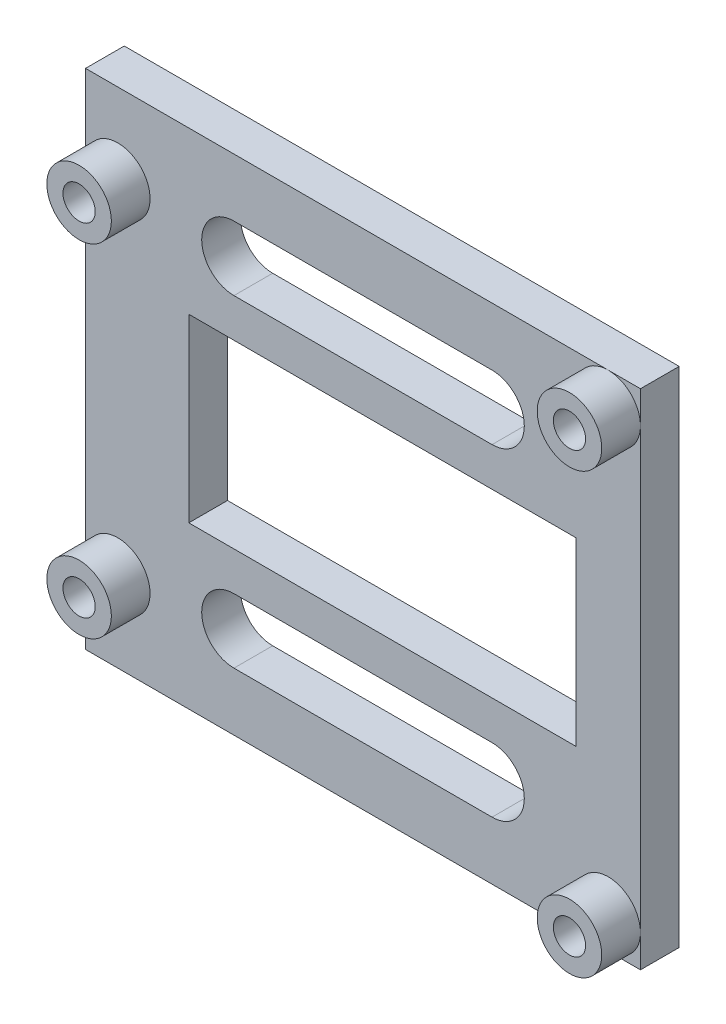
ISO-10303-21;
HEADER;
FILE_DESCRIPTION(('STEP AP214'),'2;1');
FILE_NAME('part.step','',(''),(''),'','','');
FILE_SCHEMA(('AUTOMOTIVE_DESIGN { 1 0 10303 214 1 1 1 1 }'));
ENDSEC;
DATA;
#1=APPLICATION_CONTEXT('core data for automotive mechanical design processes');
#2=APPLICATION_PROTOCOL_DEFINITION('international standard','automotive_design',2000,#1);
#3=PRODUCT_CONTEXT('',#1,'mechanical');
#4=PRODUCT('Part','Part','',(#3));
#5=PRODUCT_RELATED_PRODUCT_CATEGORY('part','',(#4));
#6=PRODUCT_DEFINITION_FORMATION('','',#4);
#7=PRODUCT_DEFINITION_CONTEXT('part definition',#1,'design');
#8=PRODUCT_DEFINITION('design','',#6,#7);
#9=PRODUCT_DEFINITION_SHAPE('','',#8);
#10=(LENGTH_UNIT() NAMED_UNIT(*) SI_UNIT(.MILLI.,.METRE.));
#11=(NAMED_UNIT(*) PLANE_ANGLE_UNIT() SI_UNIT($,.RADIAN.));
#12=(NAMED_UNIT(*) SI_UNIT($,.STERADIAN.) SOLID_ANGLE_UNIT());
#13=UNCERTAINTY_MEASURE_WITH_UNIT(LENGTH_MEASURE(1.E-05),#10,'distance_accuracy_value','');
#14=(GEOMETRIC_REPRESENTATION_CONTEXT(3) GLOBAL_UNCERTAINTY_ASSIGNED_CONTEXT((#13)) GLOBAL_UNIT_ASSIGNED_CONTEXT((#10,
#11,#12)) REPRESENTATION_CONTEXT('',''));
#15=CARTESIAN_POINT('',(0.,0.,0.));
#16=DIRECTION('',(0.,0.,1.));
#17=DIRECTION('',(1.,0.,0.));
#18=AXIS2_PLACEMENT_3D('',#15,#16,#17);
#19=CARTESIAN_POINT('',(0.,0.,3.));
#20=DIRECTION('',(0.,0.,1.));
#21=DIRECTION('',(1.,0.,0.));
#22=AXIS2_PLACEMENT_3D('',#19,#20,#21);
#23=PLANE('',#22);
#24=DIRECTION('',(0.,1.,0.));
#25=VECTOR('',#24,1.);
#26=CARTESIAN_POINT('',(21.5,19.5,3.));
#27=LINE('',#26,#25);
#28=CARTESIAN_POINT('',(21.5,-19.5,3.));
#29=VERTEX_POINT('',#28);
#30=CARTESIAN_POINT('',(21.5,-17.,3.));
#31=VERTEX_POINT('',#30);
#32=EDGE_CURVE('E319',#29,#31,#27,.T.);
#33=ORIENTED_EDGE('',*,*,#32,.T.);
#34=CARTESIAN_POINT('',(19.,-17.,3.));
#35=DIRECTION('',(0.,0.,1.));
#36=DIRECTION('',(1.,0.,0.));
#37=AXIS2_PLACEMENT_3D('',#34,#35,#36);
#38=CIRCLE('',#37,2.5);
#39=CARTESIAN_POINT('',(19.,-19.5,3.));
#40=VERTEX_POINT('',#39);
#41=EDGE_CURVE('E11',#31,#40,#38,.F.);
#42=ORIENTED_EDGE('',*,*,#41,.T.);
#43=DIRECTION('',(1.,0.,0.));
#44=VECTOR('',#43,1.);
#45=CARTESIAN_POINT('',(-21.5,-19.5,3.));
#46=LINE('',#45,#44);
#47=EDGE_CURVE('E312',#40,#29,#46,.T.);
#48=ORIENTED_EDGE('',*,*,#47,.T.);
#49=EDGE_LOOP('',(#33,#42,#48));
#50=FACE_BOUND('',#49,.T.);
#51=ADVANCED_FACE('F32',(#50),#23,.T.);
#52=CARTESIAN_POINT('',(19.,17.,3.));
#53=DIRECTION('',(0.,0.,1.));
#54=DIRECTION('',(1.,0.,0.));
#55=AXIS2_PLACEMENT_3D('',#52,#53,#54);
#56=CIRCLE('',#55,2.5);
#57=CARTESIAN_POINT('',(21.5,17.,3.));
#58=VERTEX_POINT('',#57);
#59=CARTESIAN_POINT('',(19.,19.5,3.));
#60=VERTEX_POINT('',#59);
#61=EDGE_CURVE('E301',#58,#60,#56,.T.);
#62=ORIENTED_EDGE('',*,*,#61,.F.);
#63=CARTESIAN_POINT('',(21.5,19.5,3.));
#64=VERTEX_POINT('',#63);
#65=EDGE_CURVE('E318',#58,#64,#27,.T.);
#66=ORIENTED_EDGE('',*,*,#65,.T.);
#67=DIRECTION('',(-1.,0.,0.));
#68=VECTOR('',#67,1.);
#69=CARTESIAN_POINT('',(-21.5,19.5,3.));
#70=LINE('',#69,#68);
#71=EDGE_CURVE('E324',#64,#60,#70,.T.);
#72=ORIENTED_EDGE('',*,*,#71,.T.);
#73=EDGE_LOOP('',(#62,#66,#72));
#74=FACE_BOUND('',#73,.T.);
#75=ADVANCED_FACE('F365',(#74),#23,.T.);
#76=CARTESIAN_POINT('',(-21.5,19.5,3.));
#77=DIRECTION('',(1.,0.,0.));
#78=DIRECTION('',(0.,1.,0.));
#79=AXIS2_PLACEMENT_3D('',#76,#77,#78);
#80=PLANE('',#79);
#81=DIRECTION('',(0.,-1.,0.));
#82=VECTOR('',#81,1.);
#83=CARTESIAN_POINT('',(-21.5,19.5,0.));
#84=LINE('',#83,#82);
#85=CARTESIAN_POINT('',(-21.5,19.5,0.));
#86=VERTEX_POINT('',#85);
#87=CARTESIAN_POINT('',(-21.5,-19.5,0.));
#88=VERTEX_POINT('',#87);
#89=EDGE_CURVE('E306',#86,#88,#84,.T.);
#90=ORIENTED_EDGE('',*,*,#89,.T.);
#91=DIRECTION('',(0.,0.,-1.));
#92=VECTOR('',#91,1.);
#93=CARTESIAN_POINT('',(-21.5,-19.5,3.));
#94=LINE('',#93,#92);
#95=CARTESIAN_POINT('',(-21.5,-19.5,3.));
#96=VERTEX_POINT('',#95);
#97=EDGE_CURVE('E343',#96,#88,#94,.T.);
#98=ORIENTED_EDGE('',*,*,#97,.F.);
#99=DIRECTION('',(0.,-1.,0.));
#100=VECTOR('',#99,1.);
#101=CARTESIAN_POINT('',(-21.5,19.5,3.));
#102=LINE('',#101,#100);
#103=CARTESIAN_POINT('',(-21.5,-13.25,3.));
#104=VERTEX_POINT('',#103);
#105=EDGE_CURVE('E314',#104,#96,#102,.T.);
#106=ORIENTED_EDGE('',*,*,#105,.F.);
#107=CARTESIAN_POINT('',(-21.5,13.25,3.));
#108=VERTEX_POINT('',#107);
#109=EDGE_CURVE('E313',#108,#104,#102,.T.);
#110=ORIENTED_EDGE('',*,*,#109,.F.);
#111=CARTESIAN_POINT('',(-21.5,19.5,3.));
#112=VERTEX_POINT('',#111);
#113=EDGE_CURVE('E309',#112,#108,#102,.T.);
#114=ORIENTED_EDGE('',*,*,#113,.F.);
#115=DIRECTION('',(0.,0.,-1.));
#116=VECTOR('',#115,1.);
#117=CARTESIAN_POINT('',(-21.5,19.5,3.));
#118=LINE('',#117,#116);
#119=EDGE_CURVE('E327',#112,#86,#118,.T.);
#120=ORIENTED_EDGE('',*,*,#119,.T.);
#121=EDGE_LOOP('',(#90,#98,#106,#110,#114,#120));
#122=FACE_BOUND('',#121,.T.);
#123=ADVANCED_FACE('F34',(#122),#80,.F.);
#124=CARTESIAN_POINT('',(-21.5,-19.5,3.));
#125=DIRECTION('',(0.,1.,0.));
#126=DIRECTION('',(0.,0.,1.));
#127=AXIS2_PLACEMENT_3D('',#124,#125,#126);
#128=PLANE('',#127);
#129=DIRECTION('',(1.,0.,0.));
#130=VECTOR('',#129,1.);
#131=CARTESIAN_POINT('',(-21.5,-19.5,0.));
#132=LINE('',#131,#130);
#133=CARTESIAN_POINT('',(21.5,-19.5,0.));
#134=VERTEX_POINT('',#133);
#135=EDGE_CURVE('E330',#88,#134,#132,.T.);
#136=ORIENTED_EDGE('',*,*,#135,.T.);
#137=DIRECTION('',(0.,0.,-1.));
#138=VECTOR('',#137,1.);
#139=CARTESIAN_POINT('',(21.5,-19.5,3.));
#140=LINE('',#139,#138);
#141=EDGE_CURVE('E341',#29,#134,#140,.T.);
#142=ORIENTED_EDGE('',*,*,#141,.F.);
#143=ORIENTED_EDGE('',*,*,#47,.F.);
#144=EDGE_CURVE('E315',#96,#40,#46,.T.);
#145=ORIENTED_EDGE('',*,*,#144,.F.);
#146=ORIENTED_EDGE('',*,*,#97,.T.);
#147=EDGE_LOOP('',(#136,#142,#143,#145,#146));
#148=FACE_BOUND('',#147,.T.);
#149=ADVANCED_FACE('F484',(#148),#128,.F.);
#150=CARTESIAN_POINT('',(21.5,19.5,3.));
#151=DIRECTION('',(-1.,0.,0.));
#152=DIRECTION('',(0.,-1.,0.));
#153=AXIS2_PLACEMENT_3D('',#150,#151,#152);
#154=PLANE('',#153);
#155=DIRECTION('',(0.,1.,0.));
#156=VECTOR('',#155,1.);
#157=CARTESIAN_POINT('',(21.5,19.5,0.));
#158=LINE('',#157,#156);
#159=CARTESIAN_POINT('',(21.5,19.5,0.));
#160=VERTEX_POINT('',#159);
#161=EDGE_CURVE('E332',#134,#160,#158,.T.);
#162=ORIENTED_EDGE('',*,*,#161,.T.);
#163=DIRECTION('',(0.,0.,-1.));
#164=VECTOR('',#163,1.);
#165=CARTESIAN_POINT('',(21.5,19.5,3.));
#166=LINE('',#165,#164);
#167=EDGE_CURVE('E338',#64,#160,#166,.T.);
#168=ORIENTED_EDGE('',*,*,#167,.F.);
#169=ORIENTED_EDGE('',*,*,#65,.F.);
#170=EDGE_CURVE('E323',#31,#58,#27,.T.);
#171=ORIENTED_EDGE('',*,*,#170,.F.);
#172=ORIENTED_EDGE('',*,*,#32,.F.);
#173=ORIENTED_EDGE('',*,*,#141,.T.);
#174=EDGE_LOOP('',(#162,#168,#169,#171,#172,#173));
#175=FACE_BOUND('',#174,.T.);
#176=ADVANCED_FACE('F368',(#175),#154,.F.);
#177=CARTESIAN_POINT('',(-21.5,19.5,3.));
#178=DIRECTION('',(0.,-1.,0.));
#179=DIRECTION('',(0.,0.,-1.));
#180=AXIS2_PLACEMENT_3D('',#177,#178,#179);
#181=PLANE('',#180);
#182=DIRECTION('',(-1.,0.,0.));
#183=VECTOR('',#182,1.);
#184=CARTESIAN_POINT('',(-21.5,19.5,0.));
#185=LINE('',#184,#183);
#186=EDGE_CURVE('E334',#160,#86,#185,.T.);
#187=ORIENTED_EDGE('',*,*,#186,.T.);
#188=ORIENTED_EDGE('',*,*,#119,.F.);
#189=EDGE_CURVE('E322',#60,#112,#70,.T.);
#190=ORIENTED_EDGE('',*,*,#189,.F.);
#191=ORIENTED_EDGE('',*,*,#71,.F.);
#192=ORIENTED_EDGE('',*,*,#167,.T.);
#193=EDGE_LOOP('',(#187,#188,#190,#191,#192));
#194=FACE_BOUND('',#193,.T.);
#195=ADVANCED_FACE('F362',(#194),#181,.F.);
#196=CARTESIAN_POINT('',(-10.,-12.5,3.));
#197=DIRECTION('',(0.,0.,1.));
#198=DIRECTION('',(-1.,0.,0.));
#199=AXIS2_PLACEMENT_3D('',#196,#197,#198);
#200=CIRCLE('',#199,2.5);
#201=CARTESIAN_POINT('',(-10.,-10.,3.));
#202=VERTEX_POINT('',#201);
#203=CARTESIAN_POINT('',(-10.,-15.,3.));
#204=VERTEX_POINT('',#203);
#205=EDGE_CURVE('E47',#202,#204,#200,.T.);
#206=ORIENTED_EDGE('',*,*,#205,.F.);
#207=DIRECTION('',(-1.,0.,0.));
#208=VECTOR('',#207,1.);
#209=CARTESIAN_POINT('',(-10.,-10.,3.));
#210=LINE('',#209,#208);
#211=CARTESIAN_POINT('',(10.,-9.99999999999999,3.));
#212=VERTEX_POINT('',#211);
#213=EDGE_CURVE('E181',#212,#202,#210,.T.);
#214=ORIENTED_EDGE('',*,*,#213,.F.);
#215=CARTESIAN_POINT('',(10.,-12.5,3.));
#216=DIRECTION('',(0.,0.,1.));
#217=DIRECTION('',(-1.,0.,0.));
#218=AXIS2_PLACEMENT_3D('',#215,#216,#217);
#219=CIRCLE('',#218,2.5);
#220=CARTESIAN_POINT('',(10.,-15.,3.));
#221=VERTEX_POINT('',#220);
#222=EDGE_CURVE('E184',#221,#212,#219,.T.);
#223=ORIENTED_EDGE('',*,*,#222,.F.);
#224=DIRECTION('',(1.,0.,0.));
#225=VECTOR('',#224,1.);
#226=CARTESIAN_POINT('',(-10.,-15.,3.));
#227=LINE('',#226,#225);
#228=EDGE_CURVE('E190',#204,#221,#227,.T.);
#229=ORIENTED_EDGE('',*,*,#228,.F.);
#230=EDGE_LOOP('',(#206,#214,#223,#229));
#231=FACE_BOUND('',#230,.T.);
#232=DIRECTION('',(0.,-1.,0.));
#233=VECTOR('',#232,1.);
#234=CARTESIAN_POINT('',(-13.5,7.,3.));
#235=LINE('',#234,#233);
#236=CARTESIAN_POINT('',(-13.5,7.,3.));
#237=VERTEX_POINT('',#236);
#238=CARTESIAN_POINT('',(-13.5,-7.,3.));
#239=VERTEX_POINT('',#238);
#240=EDGE_CURVE('E196',#237,#239,#235,.T.);
#241=ORIENTED_EDGE('',*,*,#240,.F.);
#242=DIRECTION('',(-1.,0.,0.));
#243=VECTOR('',#242,1.);
#244=CARTESIAN_POINT('',(-13.5,7.,3.));
#245=LINE('',#244,#243);
#246=CARTESIAN_POINT('',(16.5,7.,3.));
#247=VERTEX_POINT('',#246);
#248=EDGE_CURVE('E204',#247,#237,#245,.T.);
#249=ORIENTED_EDGE('',*,*,#248,.F.);
#250=DIRECTION('',(0.,1.,0.));
#251=VECTOR('',#250,1.);
#252=CARTESIAN_POINT('',(16.5,7.,3.));
#253=LINE('',#252,#251);
#254=CARTESIAN_POINT('',(16.5,-7.,3.));
#255=VERTEX_POINT('',#254);
#256=EDGE_CURVE('E218',#255,#247,#253,.T.);
#257=ORIENTED_EDGE('',*,*,#256,.F.);
#258=DIRECTION('',(1.,0.,0.));
#259=VECTOR('',#258,1.);
#260=CARTESIAN_POINT('',(-13.5,-7.,3.));
#261=LINE('',#260,#259);
#262=EDGE_CURVE('E215',#239,#255,#261,.T.);
#263=ORIENTED_EDGE('',*,*,#262,.F.);
#264=EDGE_LOOP('',(#241,#249,#257,#263));
#265=FACE_BOUND('',#264,.T.);
#266=CARTESIAN_POINT('',(-10.,12.5,3.));
#267=DIRECTION('',(0.,0.,1.));
#268=DIRECTION('',(1.,0.,0.));
#269=AXIS2_PLACEMENT_3D('',#266,#267,#268);
#270=CIRCLE('',#269,2.5);
#271=CARTESIAN_POINT('',(-10.,15.,3.));
#272=VERTEX_POINT('',#271);
#273=CARTESIAN_POINT('',(-10.,10.,3.));
#274=VERTEX_POINT('',#273);
#275=EDGE_CURVE('E225',#272,#274,#270,.T.);
#276=ORIENTED_EDGE('',*,*,#275,.F.);
#277=DIRECTION('',(-1.,0.,0.));
#278=VECTOR('',#277,1.);
#279=CARTESIAN_POINT('',(-10.,15.,3.));
#280=LINE('',#279,#278);
#281=CARTESIAN_POINT('',(10.,15.,3.));
#282=VERTEX_POINT('',#281);
#283=EDGE_CURVE('E236',#282,#272,#280,.T.);
#284=ORIENTED_EDGE('',*,*,#283,.F.);
#285=CARTESIAN_POINT('',(10.,12.5,3.));
#286=DIRECTION('',(0.,0.,1.));
#287=DIRECTION('',(1.,0.,0.));
#288=AXIS2_PLACEMENT_3D('',#285,#286,#287);
#289=CIRCLE('',#288,2.5);
#290=CARTESIAN_POINT('',(10.,10.,3.));
#291=VERTEX_POINT('',#290);
#292=EDGE_CURVE('E250',#291,#282,#289,.T.);
#293=ORIENTED_EDGE('',*,*,#292,.F.);
#294=DIRECTION('',(1.,0.,0.));
#295=VECTOR('',#294,1.);
#296=CARTESIAN_POINT('',(-10.,10.,3.));
#297=LINE('',#296,#295);
#298=EDGE_CURVE('E247',#274,#291,#297,.T.);
#299=ORIENTED_EDGE('',*,*,#298,.F.);
#300=EDGE_LOOP('',(#276,#284,#293,#299));
#301=FACE_BOUND('',#300,.T.);
#302=ORIENTED_EDGE('',*,*,#109,.T.);
#303=CARTESIAN_POINT('',(-19.,-13.25,3.));
#304=DIRECTION('',(0.,0.,1.));
#305=DIRECTION('',(1.,0.,0.));
#306=AXIS2_PLACEMENT_3D('',#303,#304,#305);
#307=CIRCLE('',#306,2.5);
#308=EDGE_CURVE('E285',#104,#104,#307,.T.);
#309=ORIENTED_EDGE('',*,*,#308,.F.);
#310=ORIENTED_EDGE('',*,*,#105,.T.);
#311=ORIENTED_EDGE('',*,*,#144,.T.);
#312=CARTESIAN_POINT('',(19.,-17.,3.));
#313=DIRECTION('',(0.,0.,1.));
#314=DIRECTION('',(1.,0.,0.));
#315=AXIS2_PLACEMENT_3D('',#312,#313,#314);
#316=CIRCLE('',#315,2.5);
#317=EDGE_CURVE('E291',#31,#40,#316,.T.);
#318=ORIENTED_EDGE('',*,*,#317,.F.);
#319=ORIENTED_EDGE('',*,*,#170,.T.);
#320=EDGE_CURVE('E40',#60,#58,#56,.T.);
#321=ORIENTED_EDGE('',*,*,#320,.F.);
#322=ORIENTED_EDGE('',*,*,#189,.T.);
#323=ORIENTED_EDGE('',*,*,#113,.T.);
#324=CARTESIAN_POINT('',(-19.,13.25,3.));
#325=DIRECTION('',(0.,0.,1.));
#326=DIRECTION('',(1.,0.,0.));
#327=AXIS2_PLACEMENT_3D('',#324,#325,#326);
#328=CIRCLE('',#327,2.5);
#329=EDGE_CURVE('E296',#108,#108,#328,.T.);
#330=ORIENTED_EDGE('',*,*,#329,.F.);
#331=EDGE_LOOP('',(#302,#309,#310,#311,#318,#319,#321,#322,#323,#330));
#332=FACE_BOUND('',#331,.T.);
#333=ADVANCED_FACE('F355',(#231,#265,#301,#332),#23,.T.);
#334=CARTESIAN_POINT('',(0.,0.,0.));
#335=DIRECTION('',(0.,0.,1.));
#336=DIRECTION('',(1.,0.,0.));
#337=AXIS2_PLACEMENT_3D('',#334,#335,#336);
#338=PLANE('',#337);
#339=DIRECTION('',(-1.,0.,0.));
#340=VECTOR('',#339,1.);
#341=CARTESIAN_POINT('',(-10.,-10.,0.));
#342=LINE('',#341,#340);
#343=CARTESIAN_POINT('',(10.,-9.99999999999999,0.));
#344=VERTEX_POINT('',#343);
#345=CARTESIAN_POINT('',(-10.,-10.,0.));
#346=VERTEX_POINT('',#345);
#347=EDGE_CURVE('E171',#344,#346,#342,.T.);
#348=ORIENTED_EDGE('',*,*,#347,.T.);
#349=CARTESIAN_POINT('',(-10.,-12.5,0.));
#350=DIRECTION('',(0.,0.,1.));
#351=DIRECTION('',(-1.,0.,0.));
#352=AXIS2_PLACEMENT_3D('',#349,#350,#351);
#353=CIRCLE('',#352,2.5);
#354=CARTESIAN_POINT('',(-10.,-15.,0.));
#355=VERTEX_POINT('',#354);
#356=EDGE_CURVE('E165',#346,#355,#353,.T.);
#357=ORIENTED_EDGE('',*,*,#356,.T.);
#358=DIRECTION('',(1.,0.,0.));
#359=VECTOR('',#358,1.);
#360=CARTESIAN_POINT('',(-10.,-15.,0.));
#361=LINE('',#360,#359);
#362=CARTESIAN_POINT('',(10.,-15.,0.));
#363=VERTEX_POINT('',#362);
#364=EDGE_CURVE('E174',#355,#363,#361,.T.);
#365=ORIENTED_EDGE('',*,*,#364,.T.);
#366=CARTESIAN_POINT('',(10.,-12.5,0.));
#367=DIRECTION('',(0.,0.,1.));
#368=DIRECTION('',(-1.,0.,0.));
#369=AXIS2_PLACEMENT_3D('',#366,#367,#368);
#370=CIRCLE('',#369,2.5);
#371=EDGE_CURVE('E55',#363,#344,#370,.T.);
#372=ORIENTED_EDGE('',*,*,#371,.T.);
#373=EDGE_LOOP('',(#348,#357,#365,#372));
#374=FACE_BOUND('',#373,.T.);
#375=DIRECTION('',(-1.,0.,0.));
#376=VECTOR('',#375,1.);
#377=CARTESIAN_POINT('',(-13.5,7.,0.));
#378=LINE('',#377,#376);
#379=CARTESIAN_POINT('',(16.5,7.,0.));
#380=VERTEX_POINT('',#379);
#381=CARTESIAN_POINT('',(-13.5,7.,0.));
#382=VERTEX_POINT('',#381);
#383=EDGE_CURVE('E210',#380,#382,#378,.T.);
#384=ORIENTED_EDGE('',*,*,#383,.T.);
#385=DIRECTION('',(0.,-1.,0.));
#386=VECTOR('',#385,1.);
#387=CARTESIAN_POINT('',(-13.5,7.,0.));
#388=LINE('',#387,#386);
#389=CARTESIAN_POINT('',(-13.5,-7.,0.));
#390=VERTEX_POINT('',#389);
#391=EDGE_CURVE('E200',#382,#390,#388,.T.);
#392=ORIENTED_EDGE('',*,*,#391,.T.);
#393=DIRECTION('',(1.,0.,0.));
#394=VECTOR('',#393,1.);
#395=CARTESIAN_POINT('',(-13.5,-7.,0.));
#396=LINE('',#395,#394);
#397=CARTESIAN_POINT('',(16.5,-7.,0.));
#398=VERTEX_POINT('',#397);
#399=EDGE_CURVE('E203',#390,#398,#396,.T.);
#400=ORIENTED_EDGE('',*,*,#399,.T.);
#401=DIRECTION('',(0.,1.,0.));
#402=VECTOR('',#401,1.);
#403=CARTESIAN_POINT('',(16.5,7.,0.));
#404=LINE('',#403,#402);
#405=EDGE_CURVE('E207',#398,#380,#404,.T.);
#406=ORIENTED_EDGE('',*,*,#405,.T.);
#407=EDGE_LOOP('',(#384,#392,#400,#406));
#408=FACE_BOUND('',#407,.T.);
#409=DIRECTION('',(-1.,0.,0.));
#410=VECTOR('',#409,1.);
#411=CARTESIAN_POINT('',(-10.,15.,0.));
#412=LINE('',#411,#410);
#413=CARTESIAN_POINT('',(10.,15.,0.));
#414=VERTEX_POINT('',#413);
#415=CARTESIAN_POINT('',(-10.,15.,0.));
#416=VERTEX_POINT('',#415);
#417=EDGE_CURVE('E242',#414,#416,#412,.T.);
#418=ORIENTED_EDGE('',*,*,#417,.T.);
#419=CARTESIAN_POINT('',(-10.,12.5,0.));
#420=DIRECTION('',(0.,0.,1.));
#421=DIRECTION('',(1.,0.,0.));
#422=AXIS2_PLACEMENT_3D('',#419,#420,#421);
#423=CIRCLE('',#422,2.5);
#424=CARTESIAN_POINT('',(-10.,10.,0.));
#425=VERTEX_POINT('',#424);
#426=EDGE_CURVE('E232',#416,#425,#423,.T.);
#427=ORIENTED_EDGE('',*,*,#426,.T.);
#428=DIRECTION('',(1.,0.,0.));
#429=VECTOR('',#428,1.);
#430=CARTESIAN_POINT('',(-10.,10.,0.));
#431=LINE('',#430,#429);
#432=CARTESIAN_POINT('',(10.,10.,0.));
#433=VERTEX_POINT('',#432);
#434=EDGE_CURVE('E235',#425,#433,#431,.T.);
#435=ORIENTED_EDGE('',*,*,#434,.T.);
#436=CARTESIAN_POINT('',(10.,12.5,0.));
#437=DIRECTION('',(0.,0.,1.));
#438=DIRECTION('',(1.,0.,0.));
#439=AXIS2_PLACEMENT_3D('',#436,#437,#438);
#440=CIRCLE('',#439,2.5);
#441=EDGE_CURVE('E239',#433,#414,#440,.T.);
#442=ORIENTED_EDGE('',*,*,#441,.T.);
#443=EDGE_LOOP('',(#418,#427,#435,#442));
#444=FACE_BOUND('',#443,.T.);
#445=CARTESIAN_POINT('',(-19.,-13.25,0.));
#446=DIRECTION('',(0.,0.,1.));
#447=DIRECTION('',(1.,0.,0.));
#448=AXIS2_PLACEMENT_3D('',#445,#446,#447);
#449=CIRCLE('',#448,1.25);
#450=CARTESIAN_POINT('',(-17.75,-13.25,0.));
#451=VERTEX_POINT('',#450);
#452=EDGE_CURVE('E264',#451,#451,#449,.T.);
#453=ORIENTED_EDGE('',*,*,#452,.T.);
#454=EDGE_LOOP('',(#453));
#455=FACE_BOUND('',#454,.T.);
#456=CARTESIAN_POINT('',(19.,-17.,0.));
#457=DIRECTION('',(0.,0.,1.));
#458=DIRECTION('',(1.,0.,0.));
#459=AXIS2_PLACEMENT_3D('',#456,#457,#458);
#460=CIRCLE('',#459,1.25);
#461=CARTESIAN_POINT('',(20.25,-17.,0.));
#462=VERTEX_POINT('',#461);
#463=EDGE_CURVE('E270',#462,#462,#460,.T.);
#464=ORIENTED_EDGE('',*,*,#463,.T.);
#465=EDGE_LOOP('',(#464));
#466=FACE_BOUND('',#465,.T.);
#467=CARTESIAN_POINT('',(19.,17.,0.));
#468=DIRECTION('',(0.,0.,1.));
#469=DIRECTION('',(1.,0.,0.));
#470=AXIS2_PLACEMENT_3D('',#467,#468,#469);
#471=CIRCLE('',#470,1.25);
#472=CARTESIAN_POINT('',(20.25,17.,0.));
#473=VERTEX_POINT('',#472);
#474=EDGE_CURVE('E276',#473,#473,#471,.T.);
#475=ORIENTED_EDGE('',*,*,#474,.T.);
#476=EDGE_LOOP('',(#475));
#477=FACE_BOUND('',#476,.T.);
#478=CARTESIAN_POINT('',(-19.,13.25,0.));
#479=DIRECTION('',(0.,0.,1.));
#480=DIRECTION('',(1.,0.,0.));
#481=AXIS2_PLACEMENT_3D('',#478,#479,#480);
#482=CIRCLE('',#481,1.25);
#483=CARTESIAN_POINT('',(-17.75,13.25,0.));
#484=VERTEX_POINT('',#483);
#485=EDGE_CURVE('E282',#484,#484,#482,.T.);
#486=ORIENTED_EDGE('',*,*,#485,.T.);
#487=EDGE_LOOP('',(#486));
#488=FACE_BOUND('',#487,.T.);
#489=ORIENTED_EDGE('',*,*,#89,.F.);
#490=ORIENTED_EDGE('',*,*,#186,.F.);
#491=ORIENTED_EDGE('',*,*,#161,.F.);
#492=ORIENTED_EDGE('',*,*,#135,.F.);
#493=EDGE_LOOP('',(#489,#490,#491,#492));
#494=FACE_BOUND('',#493,.T.);
#495=ADVANCED_FACE('F178',(#374,#408,#444,#455,#466,#477,#488,#494),#338,.F.);
#496=CARTESIAN_POINT('',(19.,17.,6.));
#497=DIRECTION('',(0.,0.,-1.));
#498=DIRECTION('',(-1.,0.,0.));
#499=AXIS2_PLACEMENT_3D('',#496,#497,#498);
#500=CYLINDRICAL_SURFACE('',#499,2.5);
#501=CARTESIAN_POINT('',(19.,17.,6.));
#502=DIRECTION('',(0.,0.,1.));
#503=DIRECTION('',(1.,0.,0.));
#504=AXIS2_PLACEMENT_3D('',#501,#502,#503);
#505=CIRCLE('',#504,2.5);
#506=CARTESIAN_POINT('',(21.5,17.,6.));
#507=VERTEX_POINT('',#506);
#508=EDGE_CURVE('E303',#507,#507,#505,.T.);
#509=ORIENTED_EDGE('',*,*,#508,.F.);
#510=EDGE_LOOP('',(#509));
#511=FACE_BOUND('',#510,.T.);
#512=ORIENTED_EDGE('',*,*,#61,.T.);
#513=ORIENTED_EDGE('',*,*,#320,.T.);
#514=EDGE_LOOP('',(#512,#513));
#515=FACE_BOUND('',#514,.T.);
#516=ADVANCED_FACE('F350',(#511,#515),#500,.T.);
#517=CARTESIAN_POINT('',(19.,17.,6.));
#518=DIRECTION('',(0.,0.,1.));
#519=DIRECTION('',(1.,0.,0.));
#520=AXIS2_PLACEMENT_3D('',#517,#518,#519);
#521=PLANE('',#520);
#522=CARTESIAN_POINT('',(19.,17.,6.));
#523=DIRECTION('',(0.,0.,1.));
#524=DIRECTION('',(1.,0.,0.));
#525=AXIS2_PLACEMENT_3D('',#522,#523,#524);
#526=CIRCLE('',#525,1.25);
#527=CARTESIAN_POINT('',(20.25,17.,6.));
#528=VERTEX_POINT('',#527);
#529=EDGE_CURVE('E273',#528,#528,#526,.T.);
#530=ORIENTED_EDGE('',*,*,#529,.F.);
#531=EDGE_LOOP('',(#530));
#532=FACE_BOUND('',#531,.T.);
#533=ORIENTED_EDGE('',*,*,#508,.T.);
#534=EDGE_LOOP('',(#533));
#535=FACE_BOUND('',#534,.T.);
#536=ADVANCED_FACE('F382',(#532,#535),#521,.T.);
#537=CARTESIAN_POINT('',(-19.,13.25,6.));
#538=DIRECTION('',(0.,0.,-1.));
#539=DIRECTION('',(-1.,0.,0.));
#540=AXIS2_PLACEMENT_3D('',#537,#538,#539);
#541=CYLINDRICAL_SURFACE('',#540,2.5);
#542=CARTESIAN_POINT('',(-19.,13.25,6.));
#543=DIRECTION('',(0.,0.,1.));
#544=DIRECTION('',(1.,0.,0.));
#545=AXIS2_PLACEMENT_3D('',#542,#543,#544);
#546=CIRCLE('',#545,2.5);
#547=CARTESIAN_POINT('',(-16.5,13.25,6.));
#548=VERTEX_POINT('',#547);
#549=EDGE_CURVE('E298',#548,#548,#546,.T.);
#550=ORIENTED_EDGE('',*,*,#549,.F.);
#551=EDGE_LOOP('',(#550));
#552=FACE_BOUND('',#551,.T.);
#553=ORIENTED_EDGE('',*,*,#329,.T.);
#554=EDGE_LOOP('',(#553));
#555=FACE_BOUND('',#554,.T.);
#556=ADVANCED_FACE('F379',(#552,#555),#541,.T.);
#557=CARTESIAN_POINT('',(-19.,13.25,6.));
#558=DIRECTION('',(0.,0.,1.));
#559=DIRECTION('',(1.,0.,0.));
#560=AXIS2_PLACEMENT_3D('',#557,#558,#559);
#561=PLANE('',#560);
#562=CARTESIAN_POINT('',(-19.,13.25,6.));
#563=DIRECTION('',(0.,0.,1.));
#564=DIRECTION('',(1.,0.,0.));
#565=AXIS2_PLACEMENT_3D('',#562,#563,#564);
#566=CIRCLE('',#565,1.25);
#567=CARTESIAN_POINT('',(-17.75,13.25,6.));
#568=VERTEX_POINT('',#567);
#569=EDGE_CURVE('E279',#568,#568,#566,.T.);
#570=ORIENTED_EDGE('',*,*,#569,.F.);
#571=EDGE_LOOP('',(#570));
#572=FACE_BOUND('',#571,.T.);
#573=ORIENTED_EDGE('',*,*,#549,.T.);
#574=EDGE_LOOP('',(#573));
#575=FACE_BOUND('',#574,.T.);
#576=ADVANCED_FACE('F381',(#572,#575),#561,.T.);
#577=CARTESIAN_POINT('',(19.,-17.,6.));
#578=DIRECTION('',(0.,0.,-1.));
#579=DIRECTION('',(-1.,0.,0.));
#580=AXIS2_PLACEMENT_3D('',#577,#578,#579);
#581=CYLINDRICAL_SURFACE('',#580,2.5);
#582=CARTESIAN_POINT('',(19.,-17.,6.));
#583=DIRECTION('',(0.,0.,1.));
#584=DIRECTION('',(1.,0.,0.));
#585=AXIS2_PLACEMENT_3D('',#582,#583,#584);
#586=CIRCLE('',#585,2.5);
#587=CARTESIAN_POINT('',(21.5,-17.,6.));
#588=VERTEX_POINT('',#587);
#589=EDGE_CURVE('E293',#588,#588,#586,.T.);
#590=ORIENTED_EDGE('',*,*,#589,.F.);
#591=EDGE_LOOP('',(#590));
#592=FACE_BOUND('',#591,.T.);
#593=ORIENTED_EDGE('',*,*,#317,.T.);
#594=ORIENTED_EDGE('',*,*,#41,.F.);
#595=EDGE_LOOP('',(#593,#594));
#596=FACE_BOUND('',#595,.T.);
#597=ADVANCED_FACE('F389',(#592,#596),#581,.T.);
#598=CARTESIAN_POINT('',(19.,-17.,6.));
#599=DIRECTION('',(0.,0.,1.));
#600=DIRECTION('',(1.,0.,0.));
#601=AXIS2_PLACEMENT_3D('',#598,#599,#600);
#602=PLANE('',#601);
#603=CARTESIAN_POINT('',(19.,-17.,6.));
#604=DIRECTION('',(0.,0.,1.));
#605=DIRECTION('',(1.,0.,0.));
#606=AXIS2_PLACEMENT_3D('',#603,#604,#605);
#607=CIRCLE('',#606,1.25);
#608=CARTESIAN_POINT('',(20.25,-17.,6.));
#609=VERTEX_POINT('',#608);
#610=EDGE_CURVE('E267',#609,#609,#607,.T.);
#611=ORIENTED_EDGE('',*,*,#610,.F.);
#612=EDGE_LOOP('',(#611));
#613=FACE_BOUND('',#612,.T.);
#614=ORIENTED_EDGE('',*,*,#589,.T.);
#615=EDGE_LOOP('',(#614));
#616=FACE_BOUND('',#615,.T.);
#617=ADVANCED_FACE('F470',(#613,#616),#602,.T.);
#618=CARTESIAN_POINT('',(-19.,-13.25,6.));
#619=DIRECTION('',(0.,0.,-1.));
#620=DIRECTION('',(-1.,0.,0.));
#621=AXIS2_PLACEMENT_3D('',#618,#619,#620);
#622=CYLINDRICAL_SURFACE('',#621,2.5);
#623=CARTESIAN_POINT('',(-19.,-13.25,6.));
#624=DIRECTION('',(0.,0.,1.));
#625=DIRECTION('',(1.,0.,0.));
#626=AXIS2_PLACEMENT_3D('',#623,#624,#625);
#627=CIRCLE('',#626,2.5);
#628=CARTESIAN_POINT('',(-16.5,-13.25,6.));
#629=VERTEX_POINT('',#628);
#630=EDGE_CURVE('E288',#629,#629,#627,.T.);
#631=ORIENTED_EDGE('',*,*,#630,.F.);
#632=EDGE_LOOP('',(#631));
#633=FACE_BOUND('',#632,.T.);
#634=ORIENTED_EDGE('',*,*,#308,.T.);
#635=EDGE_LOOP('',(#634));
#636=FACE_BOUND('',#635,.T.);
#637=ADVANCED_FACE('F466',(#633,#636),#622,.T.);
#638=CARTESIAN_POINT('',(-19.,-13.25,6.));
#639=DIRECTION('',(0.,0.,1.));
#640=DIRECTION('',(1.,0.,0.));
#641=AXIS2_PLACEMENT_3D('',#638,#639,#640);
#642=PLANE('',#641);
#643=CARTESIAN_POINT('',(-19.,-13.25,6.));
#644=DIRECTION('',(0.,0.,1.));
#645=DIRECTION('',(1.,0.,0.));
#646=AXIS2_PLACEMENT_3D('',#643,#644,#645);
#647=CIRCLE('',#646,1.25);
#648=CARTESIAN_POINT('',(-17.75,-13.25,6.));
#649=VERTEX_POINT('',#648);
#650=EDGE_CURVE('E257',#649,#649,#647,.T.);
#651=ORIENTED_EDGE('',*,*,#650,.F.);
#652=EDGE_LOOP('',(#651));
#653=FACE_BOUND('',#652,.T.);
#654=ORIENTED_EDGE('',*,*,#630,.T.);
#655=EDGE_LOOP('',(#654));
#656=FACE_BOUND('',#655,.T.);
#657=ADVANCED_FACE('F462',(#653,#656),#642,.T.);
#658=CARTESIAN_POINT('',(-19.,13.25,0.));
#659=DIRECTION('',(0.,0.,1.));
#660=DIRECTION('',(1.,0.,0.));
#661=AXIS2_PLACEMENT_3D('',#658,#659,#660);
#662=CYLINDRICAL_SURFACE('',#661,1.25);
#663=ORIENTED_EDGE('',*,*,#485,.F.);
#664=EDGE_LOOP('',(#663));
#665=FACE_BOUND('',#664,.T.);
#666=ORIENTED_EDGE('',*,*,#569,.T.);
#667=EDGE_LOOP('',(#666));
#668=FACE_BOUND('',#667,.T.);
#669=ADVANCED_FACE('F458',(#665,#668),#662,.F.);
#670=CARTESIAN_POINT('',(19.,17.,0.));
#671=DIRECTION('',(0.,0.,1.));
#672=DIRECTION('',(1.,0.,0.));
#673=AXIS2_PLACEMENT_3D('',#670,#671,#672);
#674=CYLINDRICAL_SURFACE('',#673,1.25);
#675=ORIENTED_EDGE('',*,*,#474,.F.);
#676=EDGE_LOOP('',(#675));
#677=FACE_BOUND('',#676,.T.);
#678=ORIENTED_EDGE('',*,*,#529,.T.);
#679=EDGE_LOOP('',(#678));
#680=FACE_BOUND('',#679,.T.);
#681=ADVANCED_FACE('F454',(#677,#680),#674,.F.);
#682=CARTESIAN_POINT('',(19.,-17.,0.));
#683=DIRECTION('',(0.,0.,1.));
#684=DIRECTION('',(1.,0.,0.));
#685=AXIS2_PLACEMENT_3D('',#682,#683,#684);
#686=CYLINDRICAL_SURFACE('',#685,1.25);
#687=ORIENTED_EDGE('',*,*,#463,.F.);
#688=EDGE_LOOP('',(#687));
#689=FACE_BOUND('',#688,.T.);
#690=ORIENTED_EDGE('',*,*,#610,.T.);
#691=EDGE_LOOP('',(#690));
#692=FACE_BOUND('',#691,.T.);
#693=ADVANCED_FACE('F450',(#689,#692),#686,.F.);
#694=CARTESIAN_POINT('',(-19.,-13.25,0.));
#695=DIRECTION('',(0.,0.,1.));
#696=DIRECTION('',(1.,0.,0.));
#697=AXIS2_PLACEMENT_3D('',#694,#695,#696);
#698=CYLINDRICAL_SURFACE('',#697,1.25);
#699=ORIENTED_EDGE('',*,*,#452,.F.);
#700=EDGE_LOOP('',(#699));
#701=FACE_BOUND('',#700,.T.);
#702=ORIENTED_EDGE('',*,*,#650,.T.);
#703=EDGE_LOOP('',(#702));
#704=FACE_BOUND('',#703,.T.);
#705=ADVANCED_FACE('F447',(#701,#704),#698,.F.);
#706=CARTESIAN_POINT('',(-10.,12.5,0.));
#707=DIRECTION('',(0.,0.,1.));
#708=DIRECTION('',(1.,0.,0.));
#709=AXIS2_PLACEMENT_3D('',#706,#707,#708);
#710=CYLINDRICAL_SURFACE('',#709,2.5);
#711=ORIENTED_EDGE('',*,*,#275,.T.);
#712=DIRECTION('',(0.,0.,1.));
#713=VECTOR('',#712,1.);
#714=CARTESIAN_POINT('',(-10.,10.,0.));
#715=LINE('',#714,#713);
#716=EDGE_CURVE('E245',#425,#274,#715,.T.);
#717=ORIENTED_EDGE('',*,*,#716,.F.);
#718=ORIENTED_EDGE('',*,*,#426,.F.);
#719=DIRECTION('',(0.,0.,1.));
#720=VECTOR('',#719,1.);
#721=CARTESIAN_POINT('',(-10.,15.,0.));
#722=LINE('',#721,#720);
#723=EDGE_CURVE('E255',#416,#272,#722,.T.);
#724=ORIENTED_EDGE('',*,*,#723,.T.);
#725=EDGE_LOOP('',(#711,#717,#718,#724));
#726=FACE_BOUND('',#725,.T.);
#727=ADVANCED_FACE('F421',(#726),#710,.F.);
#728=CARTESIAN_POINT('',(-10.,15.,0.));
#729=DIRECTION('',(0.,1.,0.));
#730=DIRECTION('',(-1.,0.,0.));
#731=AXIS2_PLACEMENT_3D('',#728,#729,#730);
#732=PLANE('',#731);
#733=ORIENTED_EDGE('',*,*,#283,.T.);
#734=ORIENTED_EDGE('',*,*,#723,.F.);
#735=ORIENTED_EDGE('',*,*,#417,.F.);
#736=DIRECTION('',(0.,0.,1.));
#737=VECTOR('',#736,1.);
#738=CARTESIAN_POINT('',(10.,15.,0.));
#739=LINE('',#738,#737);
#740=EDGE_CURVE('E258',#414,#282,#739,.T.);
#741=ORIENTED_EDGE('',*,*,#740,.T.);
#742=EDGE_LOOP('',(#733,#734,#735,#741));
#743=FACE_BOUND('',#742,.T.);
#744=ADVANCED_FACE('F431',(#743),#732,.F.);
#745=CARTESIAN_POINT('',(10.,12.5,0.));
#746=DIRECTION('',(0.,0.,1.));
#747=DIRECTION('',(1.,0.,0.));
#748=AXIS2_PLACEMENT_3D('',#745,#746,#747);
#749=CYLINDRICAL_SURFACE('',#748,2.5);
#750=ORIENTED_EDGE('',*,*,#292,.T.);
#751=ORIENTED_EDGE('',*,*,#740,.F.);
#752=ORIENTED_EDGE('',*,*,#441,.F.);
#753=DIRECTION('',(0.,0.,1.));
#754=VECTOR('',#753,1.);
#755=CARTESIAN_POINT('',(10.,10.,0.));
#756=LINE('',#755,#754);
#757=EDGE_CURVE('E260',#433,#291,#756,.T.);
#758=ORIENTED_EDGE('',*,*,#757,.T.);
#759=EDGE_LOOP('',(#750,#751,#752,#758));
#760=FACE_BOUND('',#759,.T.);
#761=ADVANCED_FACE('F433',(#760),#749,.F.);
#762=CARTESIAN_POINT('',(-10.,10.,0.));
#763=DIRECTION('',(0.,-1.,0.));
#764=DIRECTION('',(1.,0.,0.));
#765=AXIS2_PLACEMENT_3D('',#762,#763,#764);
#766=PLANE('',#765);
#767=ORIENTED_EDGE('',*,*,#298,.T.);
#768=ORIENTED_EDGE('',*,*,#757,.F.);
#769=ORIENTED_EDGE('',*,*,#434,.F.);
#770=ORIENTED_EDGE('',*,*,#716,.T.);
#771=EDGE_LOOP('',(#767,#768,#769,#770));
#772=FACE_BOUND('',#771,.T.);
#773=ADVANCED_FACE('F425',(#772),#766,.F.);
#774=CARTESIAN_POINT('',(-13.5,7.,0.));
#775=DIRECTION('',(-1.,0.,0.));
#776=DIRECTION('',(0.,-1.,0.));
#777=AXIS2_PLACEMENT_3D('',#774,#775,#776);
#778=PLANE('',#777);
#779=ORIENTED_EDGE('',*,*,#240,.T.);
#780=DIRECTION('',(0.,0.,1.));
#781=VECTOR('',#780,1.);
#782=CARTESIAN_POINT('',(-13.5,-7.,0.));
#783=LINE('',#782,#781);
#784=EDGE_CURVE('E213',#390,#239,#783,.T.);
#785=ORIENTED_EDGE('',*,*,#784,.F.);
#786=ORIENTED_EDGE('',*,*,#391,.F.);
#787=DIRECTION('',(0.,0.,1.));
#788=VECTOR('',#787,1.);
#789=CARTESIAN_POINT('',(-13.5,7.,0.));
#790=LINE('',#789,#788);
#791=EDGE_CURVE('E223',#382,#237,#790,.T.);
#792=ORIENTED_EDGE('',*,*,#791,.T.);
#793=EDGE_LOOP('',(#779,#785,#786,#792));
#794=FACE_BOUND('',#793,.T.);
#795=ADVANCED_FACE('F440',(#794),#778,.F.);
#796=CARTESIAN_POINT('',(-13.5,7.,0.));
#797=DIRECTION('',(0.,1.,0.));
#798=DIRECTION('',(0.,0.,1.));
#799=AXIS2_PLACEMENT_3D('',#796,#797,#798);
#800=PLANE('',#799);
#801=ORIENTED_EDGE('',*,*,#248,.T.);
#802=ORIENTED_EDGE('',*,*,#791,.F.);
#803=ORIENTED_EDGE('',*,*,#383,.F.);
#804=DIRECTION('',(0.,0.,1.));
#805=VECTOR('',#804,1.);
#806=CARTESIAN_POINT('',(16.5,7.,0.));
#807=LINE('',#806,#805);
#808=EDGE_CURVE('E226',#380,#247,#807,.T.);
#809=ORIENTED_EDGE('',*,*,#808,.T.);
#810=EDGE_LOOP('',(#801,#802,#803,#809));
#811=FACE_BOUND('',#810,.T.);
#812=ADVANCED_FACE('F594',(#811),#800,.F.);
#813=CARTESIAN_POINT('',(16.5,7.,0.));
#814=DIRECTION('',(1.,0.,0.));
#815=DIRECTION('',(0.,0.,-1.));
#816=AXIS2_PLACEMENT_3D('',#813,#814,#815);
#817=PLANE('',#816);
#818=ORIENTED_EDGE('',*,*,#256,.T.);
#819=ORIENTED_EDGE('',*,*,#808,.F.);
#820=ORIENTED_EDGE('',*,*,#405,.F.);
#821=DIRECTION('',(0.,0.,1.));
#822=VECTOR('',#821,1.);
#823=CARTESIAN_POINT('',(16.5,-7.,0.));
#824=LINE('',#823,#822);
#825=EDGE_CURVE('E228',#398,#255,#824,.T.);
#826=ORIENTED_EDGE('',*,*,#825,.T.);
#827=EDGE_LOOP('',(#818,#819,#820,#826));
#828=FACE_BOUND('',#827,.T.);
#829=ADVANCED_FACE('F602',(#828),#817,.F.);
#830=CARTESIAN_POINT('',(-13.5,-7.,0.));
#831=DIRECTION('',(0.,-1.,0.));
#832=DIRECTION('',(0.,0.,-1.));
#833=AXIS2_PLACEMENT_3D('',#830,#831,#832);
#834=PLANE('',#833);
#835=ORIENTED_EDGE('',*,*,#262,.T.);
#836=ORIENTED_EDGE('',*,*,#825,.F.);
#837=ORIENTED_EDGE('',*,*,#399,.F.);
#838=ORIENTED_EDGE('',*,*,#784,.T.);
#839=EDGE_LOOP('',(#835,#836,#837,#838));
#840=FACE_BOUND('',#839,.T.);
#841=ADVANCED_FACE('F611',(#840),#834,.F.);
#842=CARTESIAN_POINT('',(-10.,-12.5,0.));
#843=DIRECTION('',(0.,0.,1.));
#844=DIRECTION('',(1.,0.,0.));
#845=AXIS2_PLACEMENT_3D('',#842,#843,#844);
#846=CYLINDRICAL_SURFACE('',#845,2.5);
#847=ORIENTED_EDGE('',*,*,#205,.T.);
#848=DIRECTION('',(0.,0.,1.));
#849=VECTOR('',#848,1.);
#850=CARTESIAN_POINT('',(-10.,-15.,0.));
#851=LINE('',#850,#849);
#852=EDGE_CURVE('E161',#355,#204,#851,.T.);
#853=ORIENTED_EDGE('',*,*,#852,.F.);
#854=ORIENTED_EDGE('',*,*,#356,.F.);
#855=DIRECTION('',(0.,0.,1.));
#856=VECTOR('',#855,1.);
#857=CARTESIAN_POINT('',(-10.,-10.,0.));
#858=LINE('',#857,#856);
#859=EDGE_CURVE('E194',#346,#202,#858,.T.);
#860=ORIENTED_EDGE('',*,*,#859,.T.);
#861=EDGE_LOOP('',(#847,#853,#854,#860));
#862=FACE_BOUND('',#861,.T.);
#863=ADVANCED_FACE('F163',(#862),#846,.F.);
#864=CARTESIAN_POINT('',(-10.,-10.,0.));
#865=DIRECTION('',(0.,1.,0.));
#866=DIRECTION('',(-1.,0.,0.));
#867=AXIS2_PLACEMENT_3D('',#864,#865,#866);
#868=PLANE('',#867);
#869=ORIENTED_EDGE('',*,*,#213,.T.);
#870=ORIENTED_EDGE('',*,*,#859,.F.);
#871=ORIENTED_EDGE('',*,*,#347,.F.);
#872=DIRECTION('',(0.,0.,1.));
#873=VECTOR('',#872,1.);
#874=CARTESIAN_POINT('',(10.,-9.99999999999999,0.));
#875=LINE('',#874,#873);
#876=EDGE_CURVE('E197',#344,#212,#875,.T.);
#877=ORIENTED_EDGE('',*,*,#876,.T.);
#878=EDGE_LOOP('',(#869,#870,#871,#877));
#879=FACE_BOUND('',#878,.T.);
#880=ADVANCED_FACE('F628',(#879),#868,.F.);
#881=CARTESIAN_POINT('',(10.,-12.5,0.));
#882=DIRECTION('',(0.,0.,1.));
#883=DIRECTION('',(1.,0.,0.));
#884=AXIS2_PLACEMENT_3D('',#881,#882,#883);
#885=CYLINDRICAL_SURFACE('',#884,2.5);
#886=ORIENTED_EDGE('',*,*,#222,.T.);
#887=ORIENTED_EDGE('',*,*,#876,.F.);
#888=ORIENTED_EDGE('',*,*,#371,.F.);
#889=DIRECTION('',(0.,0.,1.));
#890=VECTOR('',#889,1.);
#891=CARTESIAN_POINT('',(10.,-15.,0.));
#892=LINE('',#891,#890);
#893=EDGE_CURVE('E170',#363,#221,#892,.T.);
#894=ORIENTED_EDGE('',*,*,#893,.T.);
#895=EDGE_LOOP('',(#886,#887,#888,#894));
#896=FACE_BOUND('',#895,.T.);
#897=ADVANCED_FACE('F636',(#896),#885,.F.);
#898=CARTESIAN_POINT('',(-10.,-15.,0.));
#899=DIRECTION('',(0.,-1.,0.));
#900=DIRECTION('',(1.,0.,0.));
#901=AXIS2_PLACEMENT_3D('',#898,#899,#900);
#902=PLANE('',#901);
#903=ORIENTED_EDGE('',*,*,#228,.T.);
#904=ORIENTED_EDGE('',*,*,#893,.F.);
#905=ORIENTED_EDGE('',*,*,#364,.F.);
#906=ORIENTED_EDGE('',*,*,#852,.T.);
#907=EDGE_LOOP('',(#903,#904,#905,#906));
#908=FACE_BOUND('',#907,.T.);
#909=ADVANCED_FACE('F175',(#908),#902,.F.);
#910=CLOSED_SHELL('',(#51,#75,#123,#149,#176,#195,#333,#495,#516,#536,#556,#576,#597,#617,#637,
#657,#669,#681,#693,#705,#727,#744,#761,#773,#795,#812,#829,#841,#863,#880,#897,#909));
#911=MANIFOLD_SOLID_BREP('B2',#910);
#912=ADVANCED_BREP_SHAPE_REPRESENTATION('',(#18,#911),#14);
#913=SHAPE_DEFINITION_REPRESENTATION(#9,#912);
ENDSEC;
END-ISO-10303-21;
